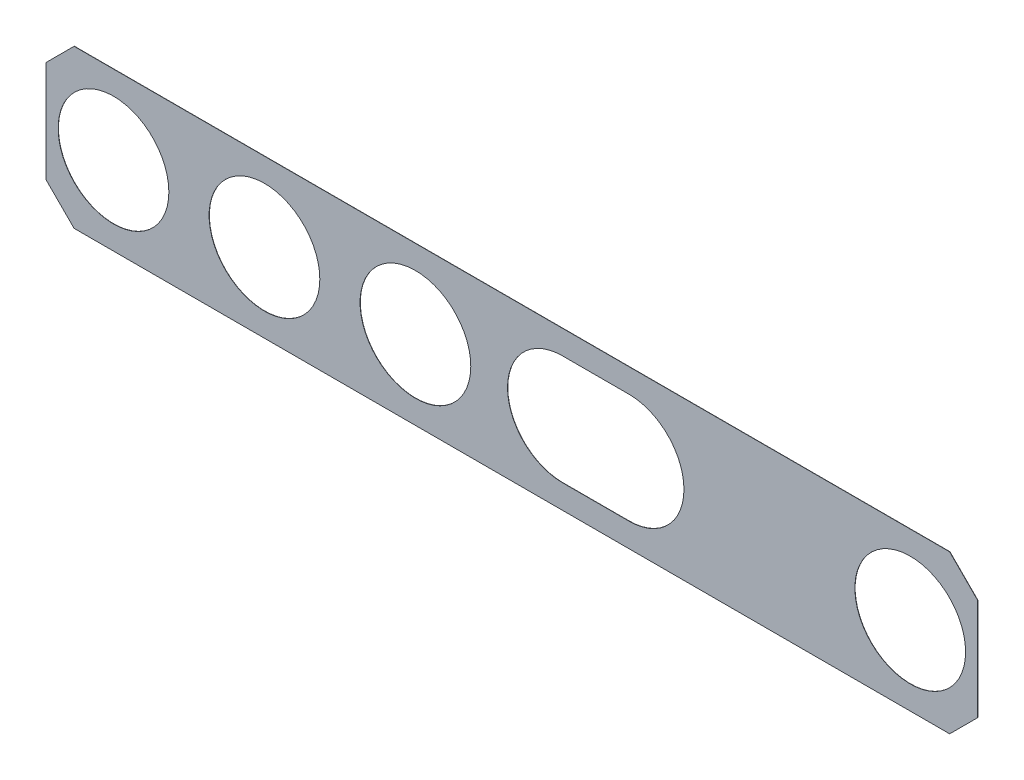
ISO-10303-21;
HEADER;
FILE_DESCRIPTION(('STEP AP214'),'2;1');
FILE_NAME('part.step','',(''),(''),'','','');
FILE_SCHEMA(('AUTOMOTIVE_DESIGN { 1 0 10303 214 1 1 1 1 }'));
ENDSEC;
DATA;
#1=APPLICATION_CONTEXT('core data for automotive mechanical design processes');
#2=APPLICATION_PROTOCOL_DEFINITION('international standard','automotive_design',2000,#1);
#3=PRODUCT_CONTEXT('',#1,'mechanical');
#4=PRODUCT('Part','Part','',(#3));
#5=PRODUCT_RELATED_PRODUCT_CATEGORY('part','',(#4));
#6=PRODUCT_DEFINITION_FORMATION('','',#4);
#7=PRODUCT_DEFINITION_CONTEXT('part definition',#1,'design');
#8=PRODUCT_DEFINITION('design','',#6,#7);
#9=PRODUCT_DEFINITION_SHAPE('','',#8);
#10=(LENGTH_UNIT() NAMED_UNIT(*) SI_UNIT(.MILLI.,.METRE.));
#11=(NAMED_UNIT(*) PLANE_ANGLE_UNIT() SI_UNIT($,.RADIAN.));
#12=(NAMED_UNIT(*) SI_UNIT($,.STERADIAN.) SOLID_ANGLE_UNIT());
#13=UNCERTAINTY_MEASURE_WITH_UNIT(LENGTH_MEASURE(1.E-05),#10,'distance_accuracy_value','');
#14=(GEOMETRIC_REPRESENTATION_CONTEXT(3) GLOBAL_UNCERTAINTY_ASSIGNED_CONTEXT((#13)) GLOBAL_UNIT_ASSIGNED_CONTEXT((#10,
#11,#12)) REPRESENTATION_CONTEXT('',''));
#15=CARTESIAN_POINT('',(0.,0.,0.));
#16=DIRECTION('',(0.,0.,1.));
#17=DIRECTION('',(1.,0.,0.));
#18=AXIS2_PLACEMENT_3D('',#15,#16,#17);
#19=CARTESIAN_POINT('',(0.,0.,-0.485));
#20=DIRECTION('',(0.,0.,1.));
#21=DIRECTION('',(1.,0.,0.));
#22=AXIS2_PLACEMENT_3D('',#19,#20,#21);
#23=PLANE('',#22);
#24=CARTESIAN_POINT('',(13.96785551477,0.,-0.485));
#25=DIRECTION('',(0.,0.,1.));
#26=DIRECTION('',(1.,0.,0.));
#27=AXIS2_PLACEMENT_3D('',#24,#25,#26);
#28=CIRCLE('',#27,6.55);
#29=CARTESIAN_POINT('',(13.96785551477,6.55,-0.485));
#30=VERTEX_POINT('',#29);
#31=CARTESIAN_POINT('',(13.96785551477,-6.55,-0.485));
#32=VERTEX_POINT('',#31);
#33=EDGE_CURVE('E118',#30,#32,#28,.F.);
#34=ORIENTED_EDGE('',*,*,#33,.T.);
#35=DIRECTION('',(1.,0.,0.));
#36=VECTOR('',#35,1.);
#37=CARTESIAN_POINT('',(13.96785551477,-6.55,-0.485));
#38=LINE('',#37,#36);
#39=CARTESIAN_POINT('',(6.032144485231,-6.55,-0.485));
#40=VERTEX_POINT('',#39);
#41=EDGE_CURVE('E120',#40,#32,#38,.T.);
#42=ORIENTED_EDGE('',*,*,#41,.F.);
#43=CARTESIAN_POINT('',(6.032144485231,0.,-0.485));
#44=DIRECTION('',(0.,0.,1.));
#45=DIRECTION('',(1.,0.,0.));
#46=AXIS2_PLACEMENT_3D('',#43,#44,#45);
#47=CIRCLE('',#46,6.55);
#48=CARTESIAN_POINT('',(6.032144485231,6.55,-0.485));
#49=VERTEX_POINT('',#48);
#50=EDGE_CURVE('E56',#40,#49,#47,.F.);
#51=ORIENTED_EDGE('',*,*,#50,.T.);
#52=DIRECTION('',(1.,0.,0.));
#53=VECTOR('',#52,1.);
#54=CARTESIAN_POINT('',(6.032144485231,6.55,-0.485));
#55=LINE('',#54,#53);
#56=EDGE_CURVE('E116',#30,#49,#55,.F.);
#57=ORIENTED_EDGE('',*,*,#56,.F.);
#58=EDGE_LOOP('',(#34,#42,#51,#57));
#59=FACE_BOUND('',#58,.T.);
#60=CARTESIAN_POINT('',(47.5,0.,-0.485));
#61=DIRECTION('',(0.,0.,1.));
#62=DIRECTION('',(1.,0.,0.));
#63=AXIS2_PLACEMENT_3D('',#60,#61,#62);
#64=CIRCLE('',#63,6.6);
#65=CARTESIAN_POINT('',(54.1,0.,-0.485));
#66=VERTEX_POINT('',#65);
#67=EDGE_CURVE('E121',#66,#66,#64,.F.);
#68=ORIENTED_EDGE('',*,*,#67,.T.);
#69=EDGE_LOOP('',(#68));
#70=FACE_BOUND('',#69,.T.);
#71=CARTESIAN_POINT('',(-47.5,0.,-0.485));
#72=DIRECTION('',(0.,0.,1.));
#73=DIRECTION('',(1.,0.,0.));
#74=AXIS2_PLACEMENT_3D('',#71,#72,#73);
#75=CIRCLE('',#74,6.6);
#76=CARTESIAN_POINT('',(-40.9,0.,-0.485));
#77=VERTEX_POINT('',#76);
#78=EDGE_CURVE('E146',#77,#77,#75,.F.);
#79=ORIENTED_EDGE('',*,*,#78,.T.);
#80=EDGE_LOOP('',(#79));
#81=FACE_BOUND('',#80,.T.);
#82=CARTESIAN_POINT('',(-29.5,0.,-0.485));
#83=DIRECTION('',(0.,0.,1.));
#84=DIRECTION('',(1.,0.,0.));
#85=AXIS2_PLACEMENT_3D('',#82,#83,#84);
#86=CIRCLE('',#85,6.6);
#87=CARTESIAN_POINT('',(-22.9,0.,-0.485));
#88=VERTEX_POINT('',#87);
#89=EDGE_CURVE('E148',#88,#88,#86,.F.);
#90=ORIENTED_EDGE('',*,*,#89,.T.);
#91=EDGE_LOOP('',(#90));
#92=FACE_BOUND('',#91,.T.);
#93=CARTESIAN_POINT('',(-11.5,0.,-0.485));
#94=DIRECTION('',(0.,0.,1.));
#95=DIRECTION('',(1.,0.,0.));
#96=AXIS2_PLACEMENT_3D('',#93,#94,#95);
#97=CIRCLE('',#96,6.6);
#98=CARTESIAN_POINT('',(-4.9,0.,-0.485));
#99=VERTEX_POINT('',#98);
#100=EDGE_CURVE('E20',#99,#99,#97,.F.);
#101=ORIENTED_EDGE('',*,*,#100,.T.);
#102=EDGE_LOOP('',(#101));
#103=FACE_BOUND('',#102,.T.);
#104=DIRECTION('',(0.,1.,0.));
#105=VECTOR('',#104,1.);
#106=CARTESIAN_POINT('',(55.55,-6.050050506339,-0.485));
#107=LINE('',#106,#105);
#108=CARTESIAN_POINT('',(55.55,6.050050506339,-0.485));
#109=VERTEX_POINT('',#108);
#110=CARTESIAN_POINT('',(55.55,-6.05005050634,-0.485));
#111=VERTEX_POINT('',#110);
#112=EDGE_CURVE('E97',#109,#111,#107,.F.);
#113=ORIENTED_EDGE('',*,*,#112,.F.);
#114=DIRECTION('',(-0.707106781186548,0.707106781186548,0.));
#115=VECTOR('',#114,1.);
#116=CARTESIAN_POINT('',(55.55,6.050050506339,-0.485));
#117=LINE('',#116,#115);
#118=CARTESIAN_POINT('',(52.2000505063397,9.39999999999975,-0.485));
#119=VERTEX_POINT('',#118);
#120=EDGE_CURVE('E68',#119,#109,#117,.F.);
#121=ORIENTED_EDGE('',*,*,#120,.F.);
#122=DIRECTION('',(1.,0.,0.));
#123=VECTOR('',#122,1.);
#124=CARTESIAN_POINT('',(52.20005050634,9.4,-0.485));
#125=LINE('',#124,#123);
#126=CARTESIAN_POINT('',(-52.20005050634,9.4,-0.485));
#127=VERTEX_POINT('',#126);
#128=EDGE_CURVE('E94',#127,#119,#125,.T.);
#129=ORIENTED_EDGE('',*,*,#128,.F.);
#130=DIRECTION('',(-0.707106781186548,-0.707106781186548,0.));
#131=VECTOR('',#130,1.);
#132=CARTESIAN_POINT('',(-52.20005050634,9.4,-0.485));
#133=LINE('',#132,#131);
#134=CARTESIAN_POINT('',(-55.55,6.05005050634,-0.485));
#135=VERTEX_POINT('',#134);
#136=EDGE_CURVE('E190',#135,#127,#133,.F.);
#137=ORIENTED_EDGE('',*,*,#136,.F.);
#138=DIRECTION('',(0.,1.,0.));
#139=VECTOR('',#138,1.);
#140=CARTESIAN_POINT('',(-55.55,6.050050506339,-0.485));
#141=LINE('',#140,#139);
#142=CARTESIAN_POINT('',(-55.55,-6.050050506339,-0.485));
#143=VERTEX_POINT('',#142);
#144=EDGE_CURVE('E184',#143,#135,#141,.T.);
#145=ORIENTED_EDGE('',*,*,#144,.F.);
#146=DIRECTION('',(0.707106781186548,-0.707106781186548,0.));
#147=VECTOR('',#146,1.);
#148=CARTESIAN_POINT('',(-55.55,-6.050050506339,-0.485));
#149=LINE('',#148,#147);
#150=CARTESIAN_POINT('',(-52.2000505063397,-9.39999999999975,-0.485));
#151=VERTEX_POINT('',#150);
#152=EDGE_CURVE('E178',#151,#143,#149,.F.);
#153=ORIENTED_EDGE('',*,*,#152,.F.);
#154=DIRECTION('',(1.,0.,0.));
#155=VECTOR('',#154,1.);
#156=CARTESIAN_POINT('',(-52.20005050634,-9.4,-0.485));
#157=LINE('',#156,#155);
#158=CARTESIAN_POINT('',(52.20005050634,-9.4,-0.485));
#159=VERTEX_POINT('',#158);
#160=EDGE_CURVE('E172',#159,#151,#157,.F.);
#161=ORIENTED_EDGE('',*,*,#160,.F.);
#162=DIRECTION('',(0.707106781186548,0.707106781186548,0.));
#163=VECTOR('',#162,1.);
#164=CARTESIAN_POINT('',(52.20005050634,-9.4,-0.485));
#165=LINE('',#164,#163);
#166=EDGE_CURVE('E166',#111,#159,#165,.F.);
#167=ORIENTED_EDGE('',*,*,#166,.F.);
#168=EDGE_LOOP('',(#113,#121,#129,#137,#145,#153,#161,#167));
#169=FACE_BOUND('',#168,.T.);
#170=ADVANCED_FACE('F17',(#59,#70,#81,#92,#103,#169),#23,.T.);
#171=CARTESIAN_POINT('',(55.55,6.050050506339,-0.485));
#172=DIRECTION('',(0.707106781186548,0.707106781186548,0.));
#173=DIRECTION('',(-0.707106781186548,0.707106781186548,0.));
#174=AXIS2_PLACEMENT_3D('',#171,#172,#173);
#175=PLANE('',#174);
#176=DIRECTION('',(0.,0.,1.));
#177=VECTOR('',#176,1.);
#178=CARTESIAN_POINT('',(52.20005050634,9.4,-0.485));
#179=LINE('',#178,#177);
#180=CARTESIAN_POINT('',(52.2000505063397,9.39999999999975,-0.515));
#181=VERTEX_POINT('',#180);
#182=EDGE_CURVE('E98',#119,#181,#179,.F.);
#183=ORIENTED_EDGE('',*,*,#182,.F.);
#184=ORIENTED_EDGE('',*,*,#120,.T.);
#185=DIRECTION('',(0.,0.,-1.));
#186=VECTOR('',#185,1.);
#187=CARTESIAN_POINT('',(55.55,6.050050506339,-0.485));
#188=LINE('',#187,#186);
#189=CARTESIAN_POINT('',(55.55,6.050050506339,-0.515));
#190=VERTEX_POINT('',#189);
#191=EDGE_CURVE('E155',#190,#109,#188,.F.);
#192=ORIENTED_EDGE('',*,*,#191,.F.);
#193=DIRECTION('',(-0.707106781186441,0.707106781186654,0.));
#194=VECTOR('',#193,1.);
#195=CARTESIAN_POINT('',(55.55,6.050050506339,-0.515));
#196=LINE('',#195,#194);
#197=EDGE_CURVE('E112',#190,#181,#196,.T.);
#198=ORIENTED_EDGE('',*,*,#197,.T.);
#199=EDGE_LOOP('',(#183,#184,#192,#198));
#200=FACE_BOUND('',#199,.T.);
#201=ADVANCED_FACE('F110',(#200),#175,.T.);
#202=CARTESIAN_POINT('',(52.20005050634,9.4,-0.485));
#203=DIRECTION('',(0.,1.,0.));
#204=DIRECTION('',(0.,0.,1.));
#205=AXIS2_PLACEMENT_3D('',#202,#203,#204);
#206=PLANE('',#205);
#207=DIRECTION('',(0.,0.,1.));
#208=VECTOR('',#207,1.);
#209=CARTESIAN_POINT('',(-52.20005050634,9.4,-0.485));
#210=LINE('',#209,#208);
#211=CARTESIAN_POINT('',(-52.20005050634,9.4,-0.515));
#212=VERTEX_POINT('',#211);
#213=EDGE_CURVE('E107',#127,#212,#210,.F.);
#214=ORIENTED_EDGE('',*,*,#213,.F.);
#215=ORIENTED_EDGE('',*,*,#128,.T.);
#216=ORIENTED_EDGE('',*,*,#182,.T.);
#217=DIRECTION('',(1.,0.,0.));
#218=VECTOR('',#217,1.);
#219=CARTESIAN_POINT('',(0.,9.4,-0.515));
#220=LINE('',#219,#218);
#221=EDGE_CURVE('E204',#181,#212,#220,.F.);
#222=ORIENTED_EDGE('',*,*,#221,.T.);
#223=EDGE_LOOP('',(#214,#215,#216,#222));
#224=FACE_BOUND('',#223,.T.);
#225=ADVANCED_FACE('F103',(#224),#206,.T.);
#226=CARTESIAN_POINT('',(-52.20005050634,9.4,-0.485));
#227=DIRECTION('',(-0.707106781186548,0.707106781186548,0.));
#228=DIRECTION('',(-0.707106781186548,-0.707106781186548,0.));
#229=AXIS2_PLACEMENT_3D('',#226,#227,#228);
#230=PLANE('',#229);
#231=DIRECTION('',(0.,0.,1.));
#232=VECTOR('',#231,1.);
#233=CARTESIAN_POINT('',(-55.55,6.05005050634,-0.485));
#234=LINE('',#233,#232);
#235=CARTESIAN_POINT('',(-55.55,6.05005050634,-0.515));
#236=VERTEX_POINT('',#235);
#237=EDGE_CURVE('E187',#135,#236,#234,.F.);
#238=ORIENTED_EDGE('',*,*,#237,.F.);
#239=ORIENTED_EDGE('',*,*,#136,.T.);
#240=ORIENTED_EDGE('',*,*,#213,.T.);
#241=DIRECTION('',(-0.707106781186547,-0.707106781186548,0.));
#242=VECTOR('',#241,1.);
#243=CARTESIAN_POINT('',(-52.20005050634,9.4,-0.515));
#244=LINE('',#243,#242);
#245=EDGE_CURVE('E198',#212,#236,#244,.T.);
#246=ORIENTED_EDGE('',*,*,#245,.T.);
#247=EDGE_LOOP('',(#238,#239,#240,#246));
#248=FACE_BOUND('',#247,.T.);
#249=ADVANCED_FACE('F196',(#248),#230,.T.);
#250=CARTESIAN_POINT('',(-55.55,6.050050506339,-0.485));
#251=DIRECTION('',(-1.,0.,0.));
#252=DIRECTION('',(0.,0.,1.));
#253=AXIS2_PLACEMENT_3D('',#250,#251,#252);
#254=PLANE('',#253);
#255=DIRECTION('',(0.,0.,1.));
#256=VECTOR('',#255,1.);
#257=CARTESIAN_POINT('',(-55.55,-6.050050506339,-0.485));
#258=LINE('',#257,#256);
#259=CARTESIAN_POINT('',(-55.55,-6.050050506339,-0.515));
#260=VERTEX_POINT('',#259);
#261=EDGE_CURVE('E181',#143,#260,#258,.F.);
#262=ORIENTED_EDGE('',*,*,#261,.F.);
#263=ORIENTED_EDGE('',*,*,#144,.T.);
#264=ORIENTED_EDGE('',*,*,#237,.T.);
#265=DIRECTION('',(0.,1.,0.));
#266=VECTOR('',#265,1.);
#267=CARTESIAN_POINT('',(-55.55,0.,-0.515));
#268=LINE('',#267,#266);
#269=EDGE_CURVE('E207',#236,#260,#268,.F.);
#270=ORIENTED_EDGE('',*,*,#269,.T.);
#271=EDGE_LOOP('',(#262,#263,#264,#270));
#272=FACE_BOUND('',#271,.T.);
#273=ADVANCED_FACE('F245',(#272),#254,.T.);
#274=CARTESIAN_POINT('',(-55.55,-6.050050506339,-0.485));
#275=DIRECTION('',(-0.707106781186548,-0.707106781186548,0.));
#276=DIRECTION('',(0.707106781186548,-0.707106781186548,0.));
#277=AXIS2_PLACEMENT_3D('',#274,#275,#276);
#278=PLANE('',#277);
#279=DIRECTION('',(0.,0.,-1.));
#280=VECTOR('',#279,1.);
#281=CARTESIAN_POINT('',(-52.20005050634,-9.4,-0.485));
#282=LINE('',#281,#280);
#283=CARTESIAN_POINT('',(-52.2000505063397,-9.39999999999975,-0.515));
#284=VERTEX_POINT('',#283);
#285=EDGE_CURVE('E175',#151,#284,#282,.T.);
#286=ORIENTED_EDGE('',*,*,#285,.F.);
#287=ORIENTED_EDGE('',*,*,#152,.T.);
#288=ORIENTED_EDGE('',*,*,#261,.T.);
#289=DIRECTION('',(0.707106781186441,-0.707106781186654,0.));
#290=VECTOR('',#289,1.);
#291=CARTESIAN_POINT('',(-55.55,-6.050050506339,-0.515));
#292=LINE('',#291,#290);
#293=EDGE_CURVE('E240',#260,#284,#292,.T.);
#294=ORIENTED_EDGE('',*,*,#293,.T.);
#295=EDGE_LOOP('',(#286,#287,#288,#294));
#296=FACE_BOUND('',#295,.T.);
#297=ADVANCED_FACE('F264',(#296),#278,.T.);
#298=CARTESIAN_POINT('',(-52.20005050634,-9.4,-0.485));
#299=DIRECTION('',(0.,-1.,0.));
#300=DIRECTION('',(0.,0.,-1.));
#301=AXIS2_PLACEMENT_3D('',#298,#299,#300);
#302=PLANE('',#301);
#303=DIRECTION('',(0.,0.,1.));
#304=VECTOR('',#303,1.);
#305=CARTESIAN_POINT('',(52.20005050634,-9.4,-0.485));
#306=LINE('',#305,#304);
#307=CARTESIAN_POINT('',(52.20005050634,-9.4,-0.515));
#308=VERTEX_POINT('',#307);
#309=EDGE_CURVE('E169',#159,#308,#306,.F.);
#310=ORIENTED_EDGE('',*,*,#309,.F.);
#311=ORIENTED_EDGE('',*,*,#160,.T.);
#312=ORIENTED_EDGE('',*,*,#285,.T.);
#313=DIRECTION('',(1.,0.,0.));
#314=VECTOR('',#313,1.);
#315=CARTESIAN_POINT('',(0.,-9.4,-0.515));
#316=LINE('',#315,#314);
#317=EDGE_CURVE('E237',#284,#308,#316,.T.);
#318=ORIENTED_EDGE('',*,*,#317,.T.);
#319=EDGE_LOOP('',(#310,#311,#312,#318));
#320=FACE_BOUND('',#319,.T.);
#321=ADVANCED_FACE('F262',(#320),#302,.T.);
#322=CARTESIAN_POINT('',(52.20005050634,-9.4,-0.485));
#323=DIRECTION('',(0.707106781186548,-0.707106781186548,0.));
#324=DIRECTION('',(0.707106781186548,0.707106781186548,0.));
#325=AXIS2_PLACEMENT_3D('',#322,#323,#324);
#326=PLANE('',#325);
#327=DIRECTION('',(0.,0.,-1.));
#328=VECTOR('',#327,1.);
#329=CARTESIAN_POINT('',(55.55,-6.05005050634,-0.485));
#330=LINE('',#329,#328);
#331=CARTESIAN_POINT('',(55.55,-6.05005050634,-0.515));
#332=VERTEX_POINT('',#331);
#333=EDGE_CURVE('E160',#111,#332,#330,.T.);
#334=ORIENTED_EDGE('',*,*,#333,.F.);
#335=ORIENTED_EDGE('',*,*,#166,.T.);
#336=ORIENTED_EDGE('',*,*,#309,.T.);
#337=DIRECTION('',(0.707106781186547,0.707106781186548,0.));
#338=VECTOR('',#337,1.);
#339=CARTESIAN_POINT('',(52.20005050634,-9.4,-0.515));
#340=LINE('',#339,#338);
#341=EDGE_CURVE('E234',#308,#332,#340,.T.);
#342=ORIENTED_EDGE('',*,*,#341,.T.);
#343=EDGE_LOOP('',(#334,#335,#336,#342));
#344=FACE_BOUND('',#343,.T.);
#345=ADVANCED_FACE('F258',(#344),#326,.T.);
#346=CARTESIAN_POINT('',(55.55,-6.050050506339,-0.485));
#347=DIRECTION('',(1.,0.,0.));
#348=DIRECTION('',(0.,0.,-1.));
#349=AXIS2_PLACEMENT_3D('',#346,#347,#348);
#350=PLANE('',#349);
#351=ORIENTED_EDGE('',*,*,#191,.T.);
#352=ORIENTED_EDGE('',*,*,#112,.T.);
#353=ORIENTED_EDGE('',*,*,#333,.T.);
#354=DIRECTION('',(0.,1.,0.));
#355=VECTOR('',#354,1.);
#356=CARTESIAN_POINT('',(55.55,0.,-0.515));
#357=LINE('',#356,#355);
#358=EDGE_CURVE('E138',#332,#190,#357,.T.);
#359=ORIENTED_EDGE('',*,*,#358,.T.);
#360=EDGE_LOOP('',(#351,#352,#353,#359));
#361=FACE_BOUND('',#360,.T.);
#362=ADVANCED_FACE('F255',(#361),#350,.T.);
#363=CARTESIAN_POINT('',(-11.5,0.,-0.485));
#364=DIRECTION('',(0.,0.,1.));
#365=DIRECTION('',(1.,0.,0.));
#366=AXIS2_PLACEMENT_3D('',#363,#364,#365);
#367=CYLINDRICAL_SURFACE('',#366,6.6);
#368=CARTESIAN_POINT('',(-11.5,0.,-0.515));
#369=DIRECTION('',(0.,0.,1.));
#370=DIRECTION('',(1.,0.,0.));
#371=AXIS2_PLACEMENT_3D('',#368,#369,#370);
#372=CIRCLE('',#371,6.6);
#373=CARTESIAN_POINT('',(-4.9,0.,-0.515));
#374=VERTEX_POINT('',#373);
#375=EDGE_CURVE('E135',#374,#374,#372,.F.);
#376=ORIENTED_EDGE('',*,*,#375,.T.);
#377=EDGE_LOOP('',(#376));
#378=FACE_BOUND('',#377,.T.);
#379=ORIENTED_EDGE('',*,*,#100,.F.);
#380=EDGE_LOOP('',(#379));
#381=FACE_BOUND('',#380,.T.);
#382=ADVANCED_FACE('F300',(#378,#381),#367,.F.);
#383=CARTESIAN_POINT('',(-29.5,0.,-0.485));
#384=DIRECTION('',(0.,0.,1.));
#385=DIRECTION('',(1.,0.,0.));
#386=AXIS2_PLACEMENT_3D('',#383,#384,#385);
#387=CYLINDRICAL_SURFACE('',#386,6.6);
#388=CARTESIAN_POINT('',(-29.5,0.,-0.515));
#389=DIRECTION('',(0.,0.,1.));
#390=DIRECTION('',(1.,0.,0.));
#391=AXIS2_PLACEMENT_3D('',#388,#389,#390);
#392=CIRCLE('',#391,6.6);
#393=CARTESIAN_POINT('',(-22.9,0.,-0.515));
#394=VERTEX_POINT('',#393);
#395=EDGE_CURVE('E132',#394,#394,#392,.F.);
#396=ORIENTED_EDGE('',*,*,#395,.T.);
#397=EDGE_LOOP('',(#396));
#398=FACE_BOUND('',#397,.T.);
#399=ORIENTED_EDGE('',*,*,#89,.F.);
#400=EDGE_LOOP('',(#399));
#401=FACE_BOUND('',#400,.T.);
#402=ADVANCED_FACE('F296',(#398,#401),#387,.F.);
#403=CARTESIAN_POINT('',(-47.5,0.,-0.485));
#404=DIRECTION('',(0.,0.,1.));
#405=DIRECTION('',(1.,0.,0.));
#406=AXIS2_PLACEMENT_3D('',#403,#404,#405);
#407=CYLINDRICAL_SURFACE('',#406,6.6);
#408=CARTESIAN_POINT('',(-47.5,0.,-0.515));
#409=DIRECTION('',(0.,0.,1.));
#410=DIRECTION('',(1.,0.,0.));
#411=AXIS2_PLACEMENT_3D('',#408,#409,#410);
#412=CIRCLE('',#411,6.6);
#413=CARTESIAN_POINT('',(-40.9,0.,-0.515));
#414=VERTEX_POINT('',#413);
#415=EDGE_CURVE('E129',#414,#414,#412,.F.);
#416=ORIENTED_EDGE('',*,*,#415,.T.);
#417=EDGE_LOOP('',(#416));
#418=FACE_BOUND('',#417,.T.);
#419=ORIENTED_EDGE('',*,*,#78,.F.);
#420=EDGE_LOOP('',(#419));
#421=FACE_BOUND('',#420,.T.);
#422=ADVANCED_FACE('F292',(#418,#421),#407,.F.);
#423=CARTESIAN_POINT('',(47.5,0.,-0.485));
#424=DIRECTION('',(0.,0.,1.));
#425=DIRECTION('',(1.,0.,0.));
#426=AXIS2_PLACEMENT_3D('',#423,#424,#425);
#427=CYLINDRICAL_SURFACE('',#426,6.6);
#428=CARTESIAN_POINT('',(47.5,0.,-0.515));
#429=DIRECTION('',(0.,0.,1.));
#430=DIRECTION('',(1.,0.,0.));
#431=AXIS2_PLACEMENT_3D('',#428,#429,#430);
#432=CIRCLE('',#431,6.6);
#433=CARTESIAN_POINT('',(54.1,0.,-0.515));
#434=VERTEX_POINT('',#433);
#435=EDGE_CURVE('E126',#434,#434,#432,.F.);
#436=ORIENTED_EDGE('',*,*,#435,.T.);
#437=EDGE_LOOP('',(#436));
#438=FACE_BOUND('',#437,.T.);
#439=ORIENTED_EDGE('',*,*,#67,.F.);
#440=EDGE_LOOP('',(#439));
#441=FACE_BOUND('',#440,.T.);
#442=ADVANCED_FACE('F289',(#438,#441),#427,.F.);
#443=CARTESIAN_POINT('',(13.96785551477,-6.55,-0.485));
#444=DIRECTION('',(0.,1.,0.));
#445=DIRECTION('',(0.,0.,1.));
#446=AXIS2_PLACEMENT_3D('',#443,#444,#445);
#447=PLANE('',#446);
#448=DIRECTION('',(0.,0.,1.));
#449=VECTOR('',#448,1.);
#450=CARTESIAN_POINT('',(6.032144485231,-6.55,-0.485));
#451=LINE('',#450,#449);
#452=CARTESIAN_POINT('',(6.032144485231,-6.55,-0.515));
#453=VERTEX_POINT('',#452);
#454=EDGE_CURVE('E143',#453,#40,#451,.T.);
#455=ORIENTED_EDGE('',*,*,#454,.T.);
#456=ORIENTED_EDGE('',*,*,#41,.T.);
#457=DIRECTION('',(0.,0.,1.));
#458=VECTOR('',#457,1.);
#459=CARTESIAN_POINT('',(13.96785551477,-6.55,-0.485));
#460=LINE('',#459,#458);
#461=CARTESIAN_POINT('',(13.96785551477,-6.55,-0.515));
#462=VERTEX_POINT('',#461);
#463=EDGE_CURVE('E141',#32,#462,#460,.F.);
#464=ORIENTED_EDGE('',*,*,#463,.T.);
#465=DIRECTION('',(1.,0.,0.));
#466=VECTOR('',#465,1.);
#467=CARTESIAN_POINT('',(0.,-6.55,-0.515));
#468=LINE('',#467,#466);
#469=EDGE_CURVE('E125',#462,#453,#468,.F.);
#470=ORIENTED_EDGE('',*,*,#469,.T.);
#471=EDGE_LOOP('',(#455,#456,#464,#470));
#472=FACE_BOUND('',#471,.T.);
#473=ADVANCED_FACE('F222',(#472),#447,.T.);
#474=CARTESIAN_POINT('',(6.032144485231,0.,-0.485));
#475=DIRECTION('',(0.,0.,1.));
#476=DIRECTION('',(1.,0.,0.));
#477=AXIS2_PLACEMENT_3D('',#474,#475,#476);
#478=CYLINDRICAL_SURFACE('',#477,6.55);
#479=CARTESIAN_POINT('',(6.032144485231,0.,-0.515));
#480=DIRECTION('',(0.,0.,1.));
#481=DIRECTION('',(1.,0.,0.));
#482=AXIS2_PLACEMENT_3D('',#479,#480,#481);
#483=CIRCLE('',#482,6.55);
#484=CARTESIAN_POINT('',(6.032144485231,6.55,-0.515));
#485=VERTEX_POINT('',#484);
#486=EDGE_CURVE('E123',#453,#485,#483,.F.);
#487=ORIENTED_EDGE('',*,*,#486,.T.);
#488=DIRECTION('',(0.,0.,-1.));
#489=VECTOR('',#488,1.);
#490=CARTESIAN_POINT('',(6.032144485231,6.55,-0.485));
#491=LINE('',#490,#489);
#492=EDGE_CURVE('E119',#49,#485,#491,.T.);
#493=ORIENTED_EDGE('',*,*,#492,.F.);
#494=ORIENTED_EDGE('',*,*,#50,.F.);
#495=ORIENTED_EDGE('',*,*,#454,.F.);
#496=EDGE_LOOP('',(#487,#493,#494,#495));
#497=FACE_BOUND('',#496,.T.);
#498=ADVANCED_FACE('F226',(#497),#478,.F.);
#499=CARTESIAN_POINT('',(6.032144485231,6.55,-0.485));
#500=DIRECTION('',(0.,-1.,0.));
#501=DIRECTION('',(0.,0.,-1.));
#502=AXIS2_PLACEMENT_3D('',#499,#500,#501);
#503=PLANE('',#502);
#504=DIRECTION('',(0.,0.,1.));
#505=VECTOR('',#504,1.);
#506=CARTESIAN_POINT('',(13.96785551477,6.55,-0.485));
#507=LINE('',#506,#505);
#508=CARTESIAN_POINT('',(13.96785551477,6.55,-0.515));
#509=VERTEX_POINT('',#508);
#510=EDGE_CURVE('E34',#509,#30,#507,.T.);
#511=ORIENTED_EDGE('',*,*,#510,.T.);
#512=ORIENTED_EDGE('',*,*,#56,.T.);
#513=ORIENTED_EDGE('',*,*,#492,.T.);
#514=DIRECTION('',(1.,0.,0.));
#515=VECTOR('',#514,1.);
#516=CARTESIAN_POINT('',(0.,6.55,-0.515));
#517=LINE('',#516,#515);
#518=EDGE_CURVE('E26',#485,#509,#517,.T.);
#519=ORIENTED_EDGE('',*,*,#518,.T.);
#520=EDGE_LOOP('',(#511,#512,#513,#519));
#521=FACE_BOUND('',#520,.T.);
#522=ADVANCED_FACE('F280',(#521),#503,.T.);
#523=CARTESIAN_POINT('',(13.96785551477,0.,-0.485));
#524=DIRECTION('',(0.,0.,1.));
#525=DIRECTION('',(1.,0.,0.));
#526=AXIS2_PLACEMENT_3D('',#523,#524,#525);
#527=CYLINDRICAL_SURFACE('',#526,6.55);
#528=CARTESIAN_POINT('',(13.96785551477,0.,-0.515));
#529=DIRECTION('',(0.,0.,1.));
#530=DIRECTION('',(1.,0.,0.));
#531=AXIS2_PLACEMENT_3D('',#528,#529,#530);
#532=CIRCLE('',#531,6.55);
#533=EDGE_CURVE('E11',#509,#462,#532,.F.);
#534=ORIENTED_EDGE('',*,*,#533,.T.);
#535=ORIENTED_EDGE('',*,*,#463,.F.);
#536=ORIENTED_EDGE('',*,*,#33,.F.);
#537=ORIENTED_EDGE('',*,*,#510,.F.);
#538=EDGE_LOOP('',(#534,#535,#536,#537));
#539=FACE_BOUND('',#538,.T.);
#540=ADVANCED_FACE('F275',(#539),#527,.F.);
#541=CARTESIAN_POINT('',(0.,0.,-0.515));
#542=DIRECTION('',(0.,0.,1.));
#543=DIRECTION('',(1.,0.,0.));
#544=AXIS2_PLACEMENT_3D('',#541,#542,#543);
#545=PLANE('',#544);
#546=ORIENTED_EDGE('',*,*,#533,.F.);
#547=ORIENTED_EDGE('',*,*,#518,.F.);
#548=ORIENTED_EDGE('',*,*,#486,.F.);
#549=ORIENTED_EDGE('',*,*,#469,.F.);
#550=EDGE_LOOP('',(#546,#547,#548,#549));
#551=FACE_BOUND('',#550,.T.);
#552=ORIENTED_EDGE('',*,*,#435,.F.);
#553=EDGE_LOOP('',(#552));
#554=FACE_BOUND('',#553,.T.);
#555=ORIENTED_EDGE('',*,*,#415,.F.);
#556=EDGE_LOOP('',(#555));
#557=FACE_BOUND('',#556,.T.);
#558=ORIENTED_EDGE('',*,*,#395,.F.);
#559=EDGE_LOOP('',(#558));
#560=FACE_BOUND('',#559,.T.);
#561=ORIENTED_EDGE('',*,*,#375,.F.);
#562=EDGE_LOOP('',(#561));
#563=FACE_BOUND('',#562,.T.);
#564=ORIENTED_EDGE('',*,*,#341,.F.);
#565=ORIENTED_EDGE('',*,*,#317,.F.);
#566=ORIENTED_EDGE('',*,*,#293,.F.);
#567=ORIENTED_EDGE('',*,*,#269,.F.);
#568=ORIENTED_EDGE('',*,*,#245,.F.);
#569=ORIENTED_EDGE('',*,*,#221,.F.);
#570=ORIENTED_EDGE('',*,*,#197,.F.);
#571=ORIENTED_EDGE('',*,*,#358,.F.);
#572=EDGE_LOOP('',(#564,#565,#566,#567,#568,#569,#570,#571));
#573=FACE_BOUND('',#572,.T.);
#574=ADVANCED_FACE('F203',(#551,#554,#557,#560,#563,#573),#545,.F.);
#575=CLOSED_SHELL('',(#170,#201,#225,#249,#273,#297,#321,#345,#362,#382,#402,#422,#442,#473,
#498,#522,#540,#574));
#576=MANIFOLD_SOLID_BREP('B1',#575);
#577=ADVANCED_BREP_SHAPE_REPRESENTATION('',(#18,#576),#14);
#578=SHAPE_DEFINITION_REPRESENTATION(#9,#577);
ENDSEC;
END-ISO-10303-21;
